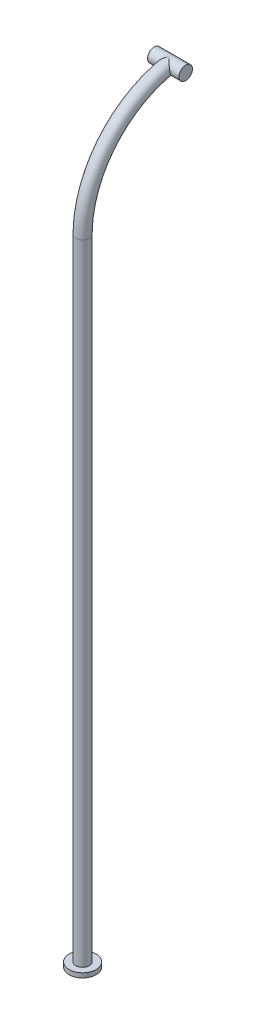
ISO-10303-21;
HEADER;
FILE_DESCRIPTION(('STEP AP214'),'2;1');
FILE_NAME('part.step','',(''),(''),'','','');
FILE_SCHEMA(('AUTOMOTIVE_DESIGN { 1 0 10303 214 1 1 1 1 }'));
ENDSEC;
DATA;
#1=APPLICATION_CONTEXT('core data for automotive mechanical design processes');
#2=APPLICATION_PROTOCOL_DEFINITION('international standard','automotive_design',2000,#1);
#3=PRODUCT_CONTEXT('',#1,'mechanical');
#4=PRODUCT('Part','Part','',(#3));
#5=PRODUCT_RELATED_PRODUCT_CATEGORY('part','',(#4));
#6=PRODUCT_DEFINITION_FORMATION('','',#4);
#7=PRODUCT_DEFINITION_CONTEXT('part definition',#1,'design');
#8=PRODUCT_DEFINITION('design','',#6,#7);
#9=PRODUCT_DEFINITION_SHAPE('','',#8);
#10=(LENGTH_UNIT() NAMED_UNIT(*) SI_UNIT(.MILLI.,.METRE.));
#11=(NAMED_UNIT(*) PLANE_ANGLE_UNIT() SI_UNIT($,.RADIAN.));
#12=(NAMED_UNIT(*) SI_UNIT($,.STERADIAN.) SOLID_ANGLE_UNIT());
#13=UNCERTAINTY_MEASURE_WITH_UNIT(LENGTH_MEASURE(1.E-05),#10,'distance_accuracy_value','');
#14=(GEOMETRIC_REPRESENTATION_CONTEXT(3) GLOBAL_UNCERTAINTY_ASSIGNED_CONTEXT((#13)) GLOBAL_UNIT_ASSIGNED_CONTEXT((#10,
#11,#12)) REPRESENTATION_CONTEXT('',''));
#15=CARTESIAN_POINT('',(0.,0.,0.));
#16=DIRECTION('',(0.,0.,1.));
#17=DIRECTION('',(1.,0.,0.));
#18=AXIS2_PLACEMENT_3D('',#15,#16,#17);
#19=CARTESIAN_POINT('',(0.,140.,0.));
#20=DIRECTION('',(0.,-1.,0.));
#21=DIRECTION('',(0.,0.,-1.));
#22=AXIS2_PLACEMENT_3D('',#19,#20,#21);
#23=CYLINDRICAL_SURFACE('',#22,1.5);
#24=CARTESIAN_POINT('',(0.,140.,0.));
#25=DIRECTION('',(0.,1.,0.));
#26=DIRECTION('',(0.,0.,1.));
#27=AXIS2_PLACEMENT_3D('',#24,#25,#26);
#28=CIRCLE('',#27,1.5);
#29=CARTESIAN_POINT('',(0.,140.,1.5));
#30=VERTEX_POINT('',#29);
#31=EDGE_CURVE('E11',#30,#30,#28,.T.);
#32=ORIENTED_EDGE('',*,*,#31,.F.);
#33=EDGE_LOOP('',(#32));
#34=FACE_BOUND('',#33,.T.);
#35=CARTESIAN_POINT('',(0.,0.,0.));
#36=DIRECTION('',(0.,1.,0.));
#37=DIRECTION('',(0.,0.,1.));
#38=AXIS2_PLACEMENT_3D('',#35,#36,#37);
#39=CIRCLE('',#38,1.5);
#40=CARTESIAN_POINT('',(0.,0.,1.5));
#41=VERTEX_POINT('',#40);
#42=EDGE_CURVE('E37',#41,#41,#39,.T.);
#43=ORIENTED_EDGE('',*,*,#42,.T.);
#44=EDGE_LOOP('',(#43));
#45=FACE_BOUND('',#44,.T.);
#46=ADVANCED_FACE('F34',(#34,#45),#23,.T.);
#47=CARTESIAN_POINT('',(0.,-1.,0.));
#48=DIRECTION('',(0.,1.,0.));
#49=DIRECTION('',(0.,0.,1.));
#50=AXIS2_PLACEMENT_3D('',#47,#48,#49);
#51=CYLINDRICAL_SURFACE('',#50,3.);
#52=CARTESIAN_POINT('',(0.,-1.,0.));
#53=DIRECTION('',(0.,-1.,0.));
#54=DIRECTION('',(0.,0.,-1.));
#55=AXIS2_PLACEMENT_3D('',#52,#53,#54);
#56=CIRCLE('',#55,3.);
#57=CARTESIAN_POINT('',(0.,-1.,-3.));
#58=VERTEX_POINT('',#57);
#59=EDGE_CURVE('E59',#58,#58,#56,.T.);
#60=ORIENTED_EDGE('',*,*,#59,.F.);
#61=EDGE_LOOP('',(#60));
#62=FACE_BOUND('',#61,.T.);
#63=CARTESIAN_POINT('',(0.,0.,0.));
#64=DIRECTION('',(0.,-1.,0.));
#65=DIRECTION('',(0.,0.,-1.));
#66=AXIS2_PLACEMENT_3D('',#63,#64,#65);
#67=CIRCLE('',#66,3.);
#68=CARTESIAN_POINT('',(0.,0.,-3.));
#69=VERTEX_POINT('',#68);
#70=EDGE_CURVE('E56',#69,#69,#67,.T.);
#71=ORIENTED_EDGE('',*,*,#70,.T.);
#72=EDGE_LOOP('',(#71));
#73=FACE_BOUND('',#72,.T.);
#74=ADVANCED_FACE('F89',(#62,#73),#51,.T.);
#75=CARTESIAN_POINT('',(0.,-1.,0.));
#76=DIRECTION('',(0.,-1.,0.));
#77=DIRECTION('',(0.,0.,-1.));
#78=AXIS2_PLACEMENT_3D('',#75,#76,#77);
#79=PLANE('',#78);
#80=ORIENTED_EDGE('',*,*,#59,.T.);
#81=EDGE_LOOP('',(#80));
#82=FACE_BOUND('',#81,.T.);
#83=ADVANCED_FACE('F94',(#82),#79,.T.);
#84=CARTESIAN_POINT('',(0.,0.,0.));
#85=DIRECTION('',(0.,-1.,0.));
#86=DIRECTION('',(0.,0.,-1.));
#87=AXIS2_PLACEMENT_3D('',#84,#85,#86);
#88=PLANE('',#87);
#89=ORIENTED_EDGE('',*,*,#42,.F.);
#90=EDGE_LOOP('',(#89));
#91=FACE_BOUND('',#90,.T.);
#92=ORIENTED_EDGE('',*,*,#70,.F.);
#93=EDGE_LOOP('',(#92));
#94=FACE_BOUND('',#93,.T.);
#95=ADVANCED_FACE('F107',(#91,#94),#88,.F.);
#96=CARTESIAN_POINT('',(0.,140.,-23.5));
#97=DIRECTION('',(1.,0.,0.));
#98=DIRECTION('',(0.,0.,-1.));
#99=AXIS2_PLACEMENT_3D('',#96,#97,#98);
#100=TOROIDAL_SURFACE('',#99,23.5,1.5);
#101=CARTESIAN_POINT('',(0.,164.620193825305,-19.1587955583268));
#102=CARTESIAN_POINT('',(-0.00185370525352711,164.619861811998,-19.1569126554161));
#103=CARTESIAN_POINT('',(-0.0037074679802043,164.619526195106,-19.1550303276243));
#104=CARTESIAN_POINT('',(-0.115881057772459,164.599000089098,-19.0411666480319));
#105=CARTESIAN_POINT('',(-0.226377501892598,164.566052234373,-18.9312538632638));
#106=CARTESIAN_POINT('',(-0.444772916300029,164.474622358396,-18.7191858927132));
#107=CARTESIAN_POINT('',(-0.552665436072427,164.416082668296,-18.6170488427424));
#108=CARTESIAN_POINT('',(-0.73432015537135,164.291643885346,-18.4505912529628));
#109=CARTESIAN_POINT('',(-0.809576325178994,164.231762220571,-18.3834034109834));
#110=CARTESIAN_POINT('',(-0.954392096067712,164.097278091331,-18.2583525801812));
#111=CARTESIAN_POINT('',(-1.02396394077786,164.022708513128,-18.2004692749422));
#112=CARTESIAN_POINT('',(-1.13745535009251,163.879851990233,-18.1107660185354));
#113=CARTESIAN_POINT('',(-1.18335127624722,163.814942007049,-18.0760787666043));
#114=CARTESIAN_POINT('',(-1.26851571888157,163.677082479366,-18.0155642587893));
#115=CARTESIAN_POINT('',(-1.30779253587502,163.604143196543,-17.9897258636069));
#116=CARTESIAN_POINT('',(-1.37020085833404,163.466918252286,-17.9533155103886));
#117=CARTESIAN_POINT('',(-1.39499155518934,163.403937274702,-17.9406968609073));
#118=CARTESIAN_POINT('',(-1.43752022044976,163.274542506387,-17.9236276863551));
#119=CARTESIAN_POINT('',(-1.45526275956155,163.208130972044,-17.9191718609258));
#120=CARTESIAN_POINT('',(-1.48246750306034,163.073069266053,-17.9193675436886));
#121=CARTESIAN_POINT('',(-1.49186701760019,163.004406100137,-17.9240871666456));
#122=CARTESIAN_POINT('',(-1.50120471128907,162.867772155485,-17.9431220038185));
#123=CARTESIAN_POINT('',(-1.5011487811936,162.799800972044,-17.9574312381576));
#124=CARTESIAN_POINT('',(-1.49206503096275,162.675146340182,-17.9927974484165));
#125=CARTESIAN_POINT('',(-1.48411659008736,162.618088240753,-18.0128364353359));
#126=CARTESIAN_POINT('',(-1.46132153450781,162.507972494756,-18.0590001867476));
#127=CARTESIAN_POINT('',(-1.44647398975483,162.454915388671,-18.0851257715204));
#128=CARTESIAN_POINT('',(-1.41025341699854,162.352460291901,-18.1430884490756));
#129=CARTESIAN_POINT('',(-1.38871871218165,162.303195601842,-18.1750579301856));
#130=CARTESIAN_POINT('',(-1.34033809671885,162.210406190437,-18.2429961925291));
#131=CARTESIAN_POINT('',(-1.31348966141161,162.166884214017,-18.278966871241));
#132=CARTESIAN_POINT('',(-1.23969169167343,162.063530443827,-18.3742498913955));
#133=CARTESIAN_POINT('',(-1.18975434313809,162.007711842341,-18.4356120184566));
#134=CARTESIAN_POINT('',(-1.08267213410524,161.909140910077,-18.5624589673256));
#135=CARTESIAN_POINT('',(-1.02550803418718,161.86642454109,-18.6279545513096));
#136=CARTESIAN_POINT('',(-0.881553762660458,161.777739851887,-18.788650154918));
#137=CARTESIAN_POINT('',(-0.792295617783103,161.737745772154,-18.8849227914429));
#138=CARTESIAN_POINT('',(-0.608208741647495,161.678737759365,-19.0783531238494));
#139=CARTESIAN_POINT('',(-0.513376598013999,161.659736822114,-19.1755113304679));
#140=CARTESIAN_POINT('',(-0.349423328825509,161.643519449176,-19.3400902135406));
#141=CARTESIAN_POINT('',(-0.281002385860627,161.64151895342,-19.4077989140195));
#142=CARTESIAN_POINT('',(-0.143563831409841,161.646512541199,-19.5420846724776));
#143=CARTESIAN_POINT('',(-0.0745474755563955,161.653490869676,-19.6086635055305));
#144=CARTESIAN_POINT('',(-0.00371115619388849,161.665150215364,-19.6762033204512));
#145=CARTESIAN_POINT('',(-0.00185556137035645,161.665458808691,-19.6779720012934));
#146=CARTESIAN_POINT('',(0.,161.665770566269,-19.6797400913276));
#147=B_SPLINE_CURVE_WITH_KNOTS('',3,(#101,#102,#103,#104,#105,#106,#107,#108,#109,#110,#111,
#112,#113,#114,#115,#116,#117,#118,#119,#120,#121,#122,#123,#124,#125,#126,#127,#128,#129,#130,
#131,#132,#133,#134,#135,#136,#137,#138,#139,#140,#141,#142,#143,#144,#145,#146),.UNSPECIFIED.,
.F.,.F.,(4,2,2,2,2,2,2,2,2,2,2,2,2,2,2,2,2,2,2,2,2,2,4),(0.,0.00798936214706477,
0.483433668523801,0.959954912276185,1.31074225811005,1.66075294007209,1.92008962997734,
2.17909864592708,2.38484781402037,2.59046333579294,2.79761109261157,3.00462979655794,
3.18676139641824,3.36891755605441,3.55587477748476,3.74292104025736,4.03175669373838,
4.32137816528418,4.7308951121055,5.14066542860271,5.42911908157099,5.71706727723054,
5.72481324995938),.UNSPECIFIED.);
#148=CARTESIAN_POINT('',(0.,164.620193825305,-19.1587955583268));
#149=VERTEX_POINT('',#148);
#150=CARTESIAN_POINT('',(0.,161.665770566269,-19.6797400913276));
#151=VERTEX_POINT('',#150);
#152=EDGE_CURVE('E49',#149,#151,#147,.T.);
#153=ORIENTED_EDGE('',*,*,#152,.T.);
#154=CARTESIAN_POINT('',(0.,161.665770566269,-19.6797400913276));
#155=CARTESIAN_POINT('',(0.00185551671666863,161.665458822323,-19.6779720428394));
#156=CARTESIAN_POINT('',(0.00371111186195192,161.665150228725,-19.6762033617295));
#157=CARTESIAN_POINT('',(0.126021310425117,161.645018109903,-19.5595851690709));
#158=CARTESIAN_POINT('',(0.246770009249581,161.638477851673,-19.4420989575475));
#159=CARTESIAN_POINT('',(0.424986802578461,161.649807022725,-19.2644784068301));
#160=CARTESIAN_POINT('',(0.483998099056038,161.657134790076,-19.2049454088838));
#161=CARTESIAN_POINT('',(0.600499902060976,161.67926655826,-19.0857966125931));
#162=CARTESIAN_POINT('',(0.6579913766119,161.694065673414,-19.0261808937151));
#163=CARTESIAN_POINT('',(0.788185045789759,161.737459646485,-18.8890175035034));
#164=CARTESIAN_POINT('',(0.86011357859182,161.768900775206,-18.8116065409687));
#165=CARTESIAN_POINT('',(0.997981398084316,161.846963966028,-18.6592420316253));
#166=CARTESIAN_POINT('',(1.06393382962486,161.893551622103,-18.5842833351726));
#167=CARTESIAN_POINT('',(1.17144756656548,161.989855276253,-18.4575233246695));
#168=CARTESIAN_POINT('',(1.21498662401495,162.035883616443,-18.404614249362));
#169=CARTESIAN_POINT('',(1.29511239442957,162.138016435008,-18.3033852553753));
#170=CARTESIAN_POINT('',(1.33170782286611,162.194108107671,-18.2550596223123));
#171=CARTESIAN_POINT('',(1.38932043184405,162.304152186475,-18.1742561957259));
#172=CARTESIAN_POINT('',(1.41198789127567,162.356320267771,-18.1405365510622));
#173=CARTESIAN_POINT('',(1.45013986733262,162.466472054276,-18.0790054925246));
#174=CARTESIAN_POINT('',(1.46562951700798,162.524451567366,-18.0511898642643));
#175=CARTESIAN_POINT('',(1.48845117293187,162.645292682077,-18.0027358152112));
#176=CARTESIAN_POINT('',(1.49573548085422,162.708180580152,-17.9821398346346));
#177=CARTESIAN_POINT('',(1.50146155242806,162.83651192316,-17.9494186927206));
#178=CARTESIAN_POINT('',(1.49990519431047,162.90195482234,-17.9372917327244));
#179=CARTESIAN_POINT('',(1.4887540648494,163.026994290206,-17.9225570181584));
#180=CARTESIAN_POINT('',(1.47991586032756,163.086571926392,-17.9191727631652));
#181=CARTESIAN_POINT('',(1.45583560731095,163.204383056781,-17.919367037355));
#182=CARTESIAN_POINT('',(1.4405924721432,163.262616321126,-17.9229467484321));
#183=CARTESIAN_POINT('',(1.4034580283715,163.380139159514,-17.936878878271));
#184=CARTESIAN_POINT('',(1.3812088143004,163.439264723178,-17.9476431956137));
#185=CARTESIAN_POINT('',(1.33160276723534,163.55376153232,-17.9754056116038));
#186=CARTESIAN_POINT('',(1.30424295874158,163.609130564934,-17.9924073474003));
#187=CARTESIAN_POINT('',(1.22943222577772,163.744579954342,-18.0424045343334));
#188=CARTESIAN_POINT('',(1.17914030804163,163.821747643955,-18.0790712503377));
#189=CARTESIAN_POINT('',(1.07172665770115,163.965425688383,-18.1620865204403));
#190=CARTESIAN_POINT('',(1.01458808435454,164.031908782354,-18.2084591662492));
#191=CARTESIAN_POINT('',(0.874627311643141,164.17581123985,-18.326246595194));
#192=CARTESIAN_POINT('',(0.789854153097643,164.248818069592,-18.4007252282578));
#193=CARTESIAN_POINT('',(0.615284337005559,164.376015811099,-18.559063623858));
#194=CARTESIAN_POINT('',(0.525484849331543,164.430195996028,-18.6429286986396));
#195=CARTESIAN_POINT('',(0.363888887597574,164.510106678054,-18.7973995224793));
#196=CARTESIAN_POINT('',(0.292619514576934,164.539501096165,-18.8667083673098));
#197=CARTESIAN_POINT('',(0.149402808832842,164.587452983427,-19.0080961851969));
#198=CARTESIAN_POINT('',(0.0774570219416578,164.606030941486,-19.0801696434417));
#199=CARTESIAN_POINT('',(0.00370748452006761,164.619526196649,-19.155030309939));
#200=CARTESIAN_POINT('',(0.00185372171889639,164.619861813736,-19.1569126377718));
#201=CARTESIAN_POINT('',(0.,164.620193825305,-19.1587955583268));
#202=B_SPLINE_CURVE_WITH_KNOTS('',3,(#154,#155,#156,#157,#158,#159,#160,#161,#162,#163,#164,
#165,#166,#167,#168,#169,#170,#171,#172,#173,#174,#175,#176,#177,#178,#179,#180,#181,#182,#183,
#184,#185,#186,#187,#188,#189,#190,#191,#192,#193,#194,#195,#196,#197,#198,#199,#200,#201),
.UNSPECIFIED.,.F.,.F.,(4,2,2,2,2,2,2,2,2,2,2,2,2,2,2,2,2,2,2,2,2,2,2,4),(0.,0.00774597272883913,
0.51055092550801,0.762744102519864,1.01477257805436,1.34448431879677,1.67345227678,
1.92025492326589,2.16674570967267,2.3643223905475,2.56175755999903,2.76033460721794,
2.95886946761541,3.13904707804909,3.31925527011712,3.51080021272694,3.70245702657655,
3.9982127697324,4.29471152310588,4.69578076395324,5.09707814830033,5.40751942146186,
5.71737071669235,5.72536007883942),.UNSPECIFIED.);
#203=EDGE_CURVE('E47',#151,#149,#202,.T.);
#204=ORIENTED_EDGE('',*,*,#203,.T.);
#205=EDGE_LOOP('',(#153,#204));
#206=FACE_BOUND('',#205,.T.);
#207=ORIENTED_EDGE('',*,*,#31,.T.);
#208=EDGE_LOOP('',(#207));
#209=FACE_BOUND('',#208,.T.);
#210=ADVANCED_FACE('F54',(#206,#209),#100,.T.);
#211=CARTESIAN_POINT('',(-3.5,163.142982195787,-19.4192678248272));
#212=DIRECTION('',(1.,0.,0.));
#213=DIRECTION('',(0.,0.,-1.));
#214=AXIS2_PLACEMENT_3D('',#211,#212,#213);
#215=CYLINDRICAL_SURFACE('',#214,1.5);
#216=CARTESIAN_POINT('',(3.5,163.142982195787,-19.4192678248272));
#217=DIRECTION('',(1.,0.,0.));
#218=DIRECTION('',(0.,0.,-1.));
#219=AXIS2_PLACEMENT_3D('',#216,#217,#218);
#220=CIRCLE('',#219,1.5);
#221=CARTESIAN_POINT('',(3.5,163.142982195787,-20.9192678248272));
#222=VERTEX_POINT('',#221);
#223=EDGE_CURVE('E157',#222,#222,#220,.T.);
#224=ORIENTED_EDGE('',*,*,#223,.F.);
#225=EDGE_LOOP('',(#224));
#226=FACE_BOUND('',#225,.T.);
#227=CARTESIAN_POINT('',(-3.5,163.142982195787,-19.4192678248272));
#228=DIRECTION('',(1.,0.,0.));
#229=DIRECTION('',(0.,0.,-1.));
#230=AXIS2_PLACEMENT_3D('',#227,#228,#229);
#231=CIRCLE('',#230,1.5);
#232=CARTESIAN_POINT('',(-3.5,163.142982195787,-20.9192678248272));
#233=VERTEX_POINT('',#232);
#234=EDGE_CURVE('E52',#233,#233,#231,.T.);
#235=ORIENTED_EDGE('',*,*,#234,.T.);
#236=EDGE_LOOP('',(#235));
#237=FACE_BOUND('',#236,.T.);
#238=ORIENTED_EDGE('',*,*,#203,.F.);
#239=ORIENTED_EDGE('',*,*,#152,.F.);
#240=EDGE_LOOP('',(#238,#239));
#241=FACE_BOUND('',#240,.T.);
#242=ADVANCED_FACE('F50',(#226,#237,#241),#215,.T.);
#243=CARTESIAN_POINT('',(-3.5,163.142982195787,-19.4192678248272));
#244=DIRECTION('',(1.,0.,0.));
#245=DIRECTION('',(0.,0.,-1.));
#246=AXIS2_PLACEMENT_3D('',#243,#244,#245);
#247=PLANE('',#246);
#248=ORIENTED_EDGE('',*,*,#234,.F.);
#249=EDGE_LOOP('',(#248));
#250=FACE_BOUND('',#249,.T.);
#251=ADVANCED_FACE('F76',(#250),#247,.F.);
#252=CARTESIAN_POINT('',(3.5,163.142982195787,-19.4192678248272));
#253=DIRECTION('',(1.,0.,0.));
#254=DIRECTION('',(0.,0.,-1.));
#255=AXIS2_PLACEMENT_3D('',#252,#253,#254);
#256=PLANE('',#255);
#257=ORIENTED_EDGE('',*,*,#223,.T.);
#258=EDGE_LOOP('',(#257));
#259=FACE_BOUND('',#258,.T.);
#260=ADVANCED_FACE('F81',(#259),#256,.T.);
#261=CLOSED_SHELL('',(#46,#74,#83,#95,#210,#242,#251,#260));
#262=MANIFOLD_SOLID_BREP('B2',#261);
#263=ADVANCED_BREP_SHAPE_REPRESENTATION('',(#18,#262),#14);
#264=SHAPE_DEFINITION_REPRESENTATION(#9,#263);
ENDSEC;
END-ISO-10303-21;
